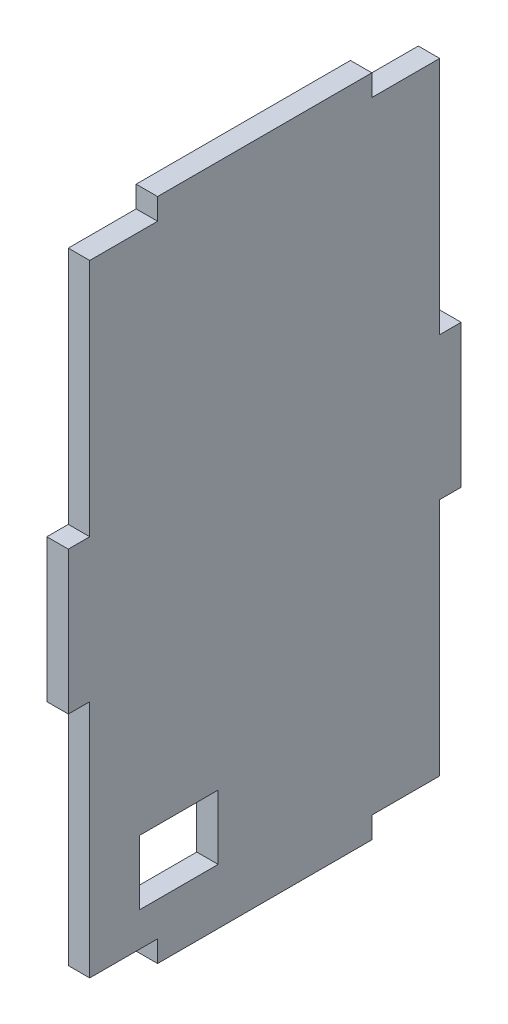
ISO-10303-21;
HEADER;
FILE_DESCRIPTION(('STEP AP214'),'2;1');
FILE_NAME('part.step','',(''),(''),'','','');
FILE_SCHEMA(('AUTOMOTIVE_DESIGN { 1 0 10303 214 1 1 1 1 }'));
ENDSEC;
DATA;
#1=APPLICATION_CONTEXT('core data for automotive mechanical design processes');
#2=APPLICATION_PROTOCOL_DEFINITION('international standard','automotive_design',2000,#1);
#3=PRODUCT_CONTEXT('',#1,'mechanical');
#4=PRODUCT('Part','Part','',(#3));
#5=PRODUCT_RELATED_PRODUCT_CATEGORY('part','',(#4));
#6=PRODUCT_DEFINITION_FORMATION('','',#4);
#7=PRODUCT_DEFINITION_CONTEXT('part definition',#1,'design');
#8=PRODUCT_DEFINITION('design','',#6,#7);
#9=PRODUCT_DEFINITION_SHAPE('','',#8);
#10=(LENGTH_UNIT() NAMED_UNIT(*) SI_UNIT(.MILLI.,.METRE.));
#11=(NAMED_UNIT(*) PLANE_ANGLE_UNIT() SI_UNIT($,.RADIAN.));
#12=(NAMED_UNIT(*) SI_UNIT($,.STERADIAN.) SOLID_ANGLE_UNIT());
#13=UNCERTAINTY_MEASURE_WITH_UNIT(LENGTH_MEASURE(1.E-05),#10,'distance_accuracy_value','');
#14=(GEOMETRIC_REPRESENTATION_CONTEXT(3) GLOBAL_UNCERTAINTY_ASSIGNED_CONTEXT((#13)) GLOBAL_UNIT_ASSIGNED_CONTEXT((#10,
#11,#12)) REPRESENTATION_CONTEXT('',''));
#15=CARTESIAN_POINT('',(0.,0.,0.));
#16=DIRECTION('',(0.,0.,1.));
#17=DIRECTION('',(1.,0.,0.));
#18=AXIS2_PLACEMENT_3D('',#15,#16,#17);
#19=CARTESIAN_POINT('',(3.,46.5,-27.5));
#20=DIRECTION('',(0.,0.,1.));
#21=DIRECTION('',(0.,-1.,0.));
#22=AXIS2_PLACEMENT_3D('',#19,#20,#21);
#23=PLANE('',#22);
#24=DIRECTION('',(0.,1.,0.));
#25=VECTOR('',#24,1.);
#26=CARTESIAN_POINT('',(3.,46.5,-27.5));
#27=LINE('',#26,#25);
#28=CARTESIAN_POINT('',(3.,-10.,-27.5));
#29=VERTEX_POINT('',#28);
#30=CARTESIAN_POINT('',(3.,10.,-27.5));
#31=VERTEX_POINT('',#30);
#32=EDGE_CURVE('E235',#29,#31,#27,.T.);
#33=ORIENTED_EDGE('',*,*,#32,.F.);
#34=DIRECTION('',(1.,0.,0.));
#35=VECTOR('',#34,1.);
#36=CARTESIAN_POINT('',(0.,-10.,-27.5));
#37=LINE('',#36,#35);
#38=CARTESIAN_POINT('',(0.,-10.,-27.5));
#39=VERTEX_POINT('',#38);
#40=EDGE_CURVE('E330',#39,#29,#37,.T.);
#41=ORIENTED_EDGE('',*,*,#40,.F.);
#42=DIRECTION('',(0.,1.,0.));
#43=VECTOR('',#42,1.);
#44=CARTESIAN_POINT('',(0.,46.5,-27.5));
#45=LINE('',#44,#43);
#46=CARTESIAN_POINT('',(0.,10.,-27.5));
#47=VERTEX_POINT('',#46);
#48=EDGE_CURVE('E225',#39,#47,#45,.T.);
#49=ORIENTED_EDGE('',*,*,#48,.T.);
#50=DIRECTION('',(1.,0.,0.));
#51=VECTOR('',#50,1.);
#52=CARTESIAN_POINT('',(0.,10.,-27.5));
#53=LINE('',#52,#51);
#54=EDGE_CURVE('E259',#47,#31,#53,.T.);
#55=ORIENTED_EDGE('',*,*,#54,.T.);
#56=EDGE_LOOP('',(#33,#41,#49,#55));
#57=FACE_BOUND('',#56,.T.);
#58=ADVANCED_FACE('F33',(#57),#23,.F.);
#59=CARTESIAN_POINT('',(3.,46.5,27.5));
#60=DIRECTION('',(0.,-1.,0.));
#61=DIRECTION('',(0.,0.,-1.));
#62=AXIS2_PLACEMENT_3D('',#59,#60,#61);
#63=PLANE('',#62);
#64=DIRECTION('',(0.,0.,1.));
#65=VECTOR('',#64,1.);
#66=CARTESIAN_POINT('',(3.,46.5,27.5));
#67=LINE('',#66,#65);
#68=CARTESIAN_POINT('',(3.,46.5,-15.));
#69=VERTEX_POINT('',#68);
#70=CARTESIAN_POINT('',(3.,46.5,15.));
#71=VERTEX_POINT('',#70);
#72=EDGE_CURVE('E215',#69,#71,#67,.T.);
#73=ORIENTED_EDGE('',*,*,#72,.F.);
#74=DIRECTION('',(1.,0.,0.));
#75=VECTOR('',#74,1.);
#76=CARTESIAN_POINT('',(0.,46.5,-15.));
#77=LINE('',#76,#75);
#78=CARTESIAN_POINT('',(0.,46.5,-15.));
#79=VERTEX_POINT('',#78);
#80=EDGE_CURVE('E199',#79,#69,#77,.T.);
#81=ORIENTED_EDGE('',*,*,#80,.F.);
#82=DIRECTION('',(0.,0.,1.));
#83=VECTOR('',#82,1.);
#84=CARTESIAN_POINT('',(0.,46.5,27.5));
#85=LINE('',#84,#83);
#86=CARTESIAN_POINT('',(0.,46.5,15.));
#87=VERTEX_POINT('',#86);
#88=EDGE_CURVE('E213',#79,#87,#85,.T.);
#89=ORIENTED_EDGE('',*,*,#88,.T.);
#90=DIRECTION('',(1.,0.,0.));
#91=VECTOR('',#90,1.);
#92=CARTESIAN_POINT('',(0.,46.5,15.));
#93=LINE('',#92,#91);
#94=EDGE_CURVE('E229',#87,#71,#93,.T.);
#95=ORIENTED_EDGE('',*,*,#94,.T.);
#96=EDGE_LOOP('',(#73,#81,#89,#95));
#97=FACE_BOUND('',#96,.T.);
#98=ADVANCED_FACE('F211',(#97),#63,.F.);
#99=CARTESIAN_POINT('',(3.,46.5,27.5));
#100=DIRECTION('',(0.,0.,-1.));
#101=DIRECTION('',(0.,1.,0.));
#102=AXIS2_PLACEMENT_3D('',#99,#100,#101);
#103=PLANE('',#102);
#104=DIRECTION('',(0.,-1.,0.));
#105=VECTOR('',#104,1.);
#106=CARTESIAN_POINT('',(0.,46.5,27.5));
#107=LINE('',#106,#105);
#108=CARTESIAN_POINT('',(0.,10.,27.5));
#109=VERTEX_POINT('',#108);
#110=CARTESIAN_POINT('',(0.,-10.,27.5));
#111=VERTEX_POINT('',#110);
#112=EDGE_CURVE('E224',#109,#111,#107,.T.);
#113=ORIENTED_EDGE('',*,*,#112,.T.);
#114=DIRECTION('',(1.,0.,0.));
#115=VECTOR('',#114,1.);
#116=CARTESIAN_POINT('',(0.,-10.,27.5));
#117=LINE('',#116,#115);
#118=CARTESIAN_POINT('',(3.,-10.,27.5));
#119=VERTEX_POINT('',#118);
#120=EDGE_CURVE('E277',#111,#119,#117,.T.);
#121=ORIENTED_EDGE('',*,*,#120,.T.);
#122=DIRECTION('',(0.,-1.,0.));
#123=VECTOR('',#122,1.);
#124=CARTESIAN_POINT('',(3.,46.5,27.5));
#125=LINE('',#124,#123);
#126=CARTESIAN_POINT('',(3.,10.,27.5));
#127=VERTEX_POINT('',#126);
#128=EDGE_CURVE('E41',#127,#119,#125,.T.);
#129=ORIENTED_EDGE('',*,*,#128,.F.);
#130=DIRECTION('',(1.,0.,0.));
#131=VECTOR('',#130,1.);
#132=CARTESIAN_POINT('',(0.,10.,27.5));
#133=LINE('',#132,#131);
#134=EDGE_CURVE('E238',#109,#127,#133,.T.);
#135=ORIENTED_EDGE('',*,*,#134,.F.);
#136=EDGE_LOOP('',(#113,#121,#129,#135));
#137=FACE_BOUND('',#136,.T.);
#138=ADVANCED_FACE('F438',(#137),#103,.F.);
#139=CARTESIAN_POINT('',(3.,-46.5,27.5));
#140=DIRECTION('',(0.,1.,0.));
#141=DIRECTION('',(0.,0.,1.));
#142=AXIS2_PLACEMENT_3D('',#139,#140,#141);
#143=PLANE('',#142);
#144=DIRECTION('',(0.,0.,-1.));
#145=VECTOR('',#144,1.);
#146=CARTESIAN_POINT('',(3.,-46.5,27.5));
#147=LINE('',#146,#145);
#148=CARTESIAN_POINT('',(3.,-46.5,15.));
#149=VERTEX_POINT('',#148);
#150=CARTESIAN_POINT('',(3.,-46.5,-15.));
#151=VERTEX_POINT('',#150);
#152=EDGE_CURVE('E11',#149,#151,#147,.T.);
#153=ORIENTED_EDGE('',*,*,#152,.F.);
#154=DIRECTION('',(1.,0.,0.));
#155=VECTOR('',#154,1.);
#156=CARTESIAN_POINT('',(0.,-46.5,15.));
#157=LINE('',#156,#155);
#158=CARTESIAN_POINT('',(0.,-46.5,15.));
#159=VERTEX_POINT('',#158);
#160=EDGE_CURVE('E268',#159,#149,#157,.T.);
#161=ORIENTED_EDGE('',*,*,#160,.F.);
#162=DIRECTION('',(0.,0.,-1.));
#163=VECTOR('',#162,1.);
#164=CARTESIAN_POINT('',(0.,-46.5,27.5));
#165=LINE('',#164,#163);
#166=CARTESIAN_POINT('',(0.,-46.5,-15.));
#167=VERTEX_POINT('',#166);
#168=EDGE_CURVE('E36',#159,#167,#165,.T.);
#169=ORIENTED_EDGE('',*,*,#168,.T.);
#170=DIRECTION('',(1.,0.,0.));
#171=VECTOR('',#170,1.);
#172=CARTESIAN_POINT('',(0.,-46.5,-15.));
#173=LINE('',#172,#171);
#174=EDGE_CURVE('E339',#167,#151,#173,.T.);
#175=ORIENTED_EDGE('',*,*,#174,.T.);
#176=EDGE_LOOP('',(#153,#161,#169,#175));
#177=FACE_BOUND('',#176,.T.);
#178=ADVANCED_FACE('F422',(#177),#143,.F.);
#179=CARTESIAN_POINT('',(3.,0.,0.));
#180=DIRECTION('',(1.,0.,0.));
#181=DIRECTION('',(0.,0.,-1.));
#182=AXIS2_PLACEMENT_3D('',#179,#180,#181);
#183=PLANE('',#182);
#184=DIRECTION('',(0.,0.,1.));
#185=VECTOR('',#184,1.);
#186=CARTESIAN_POINT('',(3.,-10.,27.5));
#187=LINE('',#186,#185);
#188=CARTESIAN_POINT('',(3.,-10.,24.5));
#189=VERTEX_POINT('',#188);
#190=EDGE_CURVE('E281',#189,#119,#187,.T.);
#191=ORIENTED_EDGE('',*,*,#190,.F.);
#192=DIRECTION('',(0.,1.,0.));
#193=VECTOR('',#192,1.);
#194=CARTESIAN_POINT('',(3.,-43.5,24.5));
#195=LINE('',#194,#193);
#196=CARTESIAN_POINT('',(3.,-43.5,24.5));
#197=VERTEX_POINT('',#196);
#198=EDGE_CURVE('E284',#197,#189,#195,.T.);
#199=ORIENTED_EDGE('',*,*,#198,.F.);
#200=DIRECTION('',(0.,0.,1.));
#201=VECTOR('',#200,1.);
#202=CARTESIAN_POINT('',(3.,-43.5,24.5));
#203=LINE('',#202,#201);
#204=CARTESIAN_POINT('',(3.,-43.5,15.));
#205=VERTEX_POINT('',#204);
#206=EDGE_CURVE('E287',#205,#197,#203,.T.);
#207=ORIENTED_EDGE('',*,*,#206,.F.);
#208=DIRECTION('',(0.,1.,0.));
#209=VECTOR('',#208,1.);
#210=CARTESIAN_POINT('',(3.,-46.5,15.));
#211=LINE('',#210,#209);
#212=EDGE_CURVE('E290',#149,#205,#211,.T.);
#213=ORIENTED_EDGE('',*,*,#212,.F.);
#214=ORIENTED_EDGE('',*,*,#152,.T.);
#215=DIRECTION('',(0.,-1.,0.));
#216=VECTOR('',#215,1.);
#217=CARTESIAN_POINT('',(3.,-46.5,-15.));
#218=LINE('',#217,#216);
#219=CARTESIAN_POINT('',(3.,-43.5,-15.));
#220=VERTEX_POINT('',#219);
#221=EDGE_CURVE('E343',#220,#151,#218,.T.);
#222=ORIENTED_EDGE('',*,*,#221,.F.);
#223=DIRECTION('',(0.,0.,1.));
#224=VECTOR('',#223,1.);
#225=CARTESIAN_POINT('',(3.,-43.5,-24.5));
#226=LINE('',#225,#224);
#227=CARTESIAN_POINT('',(3.,-43.5,-24.5));
#228=VERTEX_POINT('',#227);
#229=EDGE_CURVE('E346',#228,#220,#226,.T.);
#230=ORIENTED_EDGE('',*,*,#229,.F.);
#231=DIRECTION('',(0.,-1.,0.));
#232=VECTOR('',#231,1.);
#233=CARTESIAN_POINT('',(3.,-43.5,-24.5));
#234=LINE('',#233,#232);
#235=CARTESIAN_POINT('',(3.,-10.,-24.5));
#236=VERTEX_POINT('',#235);
#237=EDGE_CURVE('E349',#236,#228,#234,.T.);
#238=ORIENTED_EDGE('',*,*,#237,.F.);
#239=DIRECTION('',(0.,0.,1.));
#240=VECTOR('',#239,1.);
#241=CARTESIAN_POINT('',(3.,-10.,-27.5));
#242=LINE('',#241,#240);
#243=EDGE_CURVE('E280',#29,#236,#242,.T.);
#244=ORIENTED_EDGE('',*,*,#243,.F.);
#245=ORIENTED_EDGE('',*,*,#32,.T.);
#246=DIRECTION('',(0.,0.,-1.));
#247=VECTOR('',#246,1.);
#248=CARTESIAN_POINT('',(3.,10.,-27.5));
#249=LINE('',#248,#247);
#250=CARTESIAN_POINT('',(3.,10.,-24.5));
#251=VERTEX_POINT('',#250);
#252=EDGE_CURVE('E206',#251,#31,#249,.T.);
#253=ORIENTED_EDGE('',*,*,#252,.F.);
#254=DIRECTION('',(0.,-1.,0.));
#255=VECTOR('',#254,1.);
#256=CARTESIAN_POINT('',(3.,43.5,-24.5));
#257=LINE('',#256,#255);
#258=CARTESIAN_POINT('',(3.,43.5,-24.5));
#259=VERTEX_POINT('',#258);
#260=EDGE_CURVE('E372',#259,#251,#257,.T.);
#261=ORIENTED_EDGE('',*,*,#260,.F.);
#262=DIRECTION('',(0.,0.,-1.));
#263=VECTOR('',#262,1.);
#264=CARTESIAN_POINT('',(3.,43.5,-24.5));
#265=LINE('',#264,#263);
#266=CARTESIAN_POINT('',(3.,43.5,-15.));
#267=VERTEX_POINT('',#266);
#268=EDGE_CURVE('E375',#267,#259,#265,.T.);
#269=ORIENTED_EDGE('',*,*,#268,.F.);
#270=DIRECTION('',(0.,-1.,0.));
#271=VECTOR('',#270,1.);
#272=CARTESIAN_POINT('',(3.,46.5,-15.));
#273=LINE('',#272,#271);
#274=EDGE_CURVE('E342',#69,#267,#273,.T.);
#275=ORIENTED_EDGE('',*,*,#274,.F.);
#276=ORIENTED_EDGE('',*,*,#72,.T.);
#277=DIRECTION('',(0.,1.,0.));
#278=VECTOR('',#277,1.);
#279=CARTESIAN_POINT('',(3.,46.5,15.));
#280=LINE('',#279,#278);
#281=CARTESIAN_POINT('',(3.,43.5,15.));
#282=VERTEX_POINT('',#281);
#283=EDGE_CURVE('E247',#282,#71,#280,.T.);
#284=ORIENTED_EDGE('',*,*,#283,.F.);
#285=DIRECTION('',(0.,0.,-1.));
#286=VECTOR('',#285,1.);
#287=CARTESIAN_POINT('',(3.,43.5,24.5));
#288=LINE('',#287,#286);
#289=CARTESIAN_POINT('',(3.,43.5,24.5));
#290=VERTEX_POINT('',#289);
#291=EDGE_CURVE('E250',#290,#282,#288,.T.);
#292=ORIENTED_EDGE('',*,*,#291,.F.);
#293=DIRECTION('',(0.,1.,0.));
#294=VECTOR('',#293,1.);
#295=CARTESIAN_POINT('',(3.,43.5,24.5));
#296=LINE('',#295,#294);
#297=CARTESIAN_POINT('',(3.,10.,24.5));
#298=VERTEX_POINT('',#297);
#299=EDGE_CURVE('E253',#298,#290,#296,.T.);
#300=ORIENTED_EDGE('',*,*,#299,.F.);
#301=DIRECTION('',(0.,0.,-1.));
#302=VECTOR('',#301,1.);
#303=CARTESIAN_POINT('',(3.,10.,27.5));
#304=LINE('',#303,#302);
#305=EDGE_CURVE('E256',#127,#298,#304,.T.);
#306=ORIENTED_EDGE('',*,*,#305,.F.);
#307=ORIENTED_EDGE('',*,*,#128,.T.);
#308=EDGE_LOOP('',(#191,#199,#207,#213,#214,#222,#230,#238,#244,#245,#253,#261,#269,#275,#276,
#284,#292,#300,#306,#307));
#309=FACE_BOUND('',#308,.T.);
#310=DIRECTION('',(0.,1.,0.));
#311=VECTOR('',#310,1.);
#312=CARTESIAN_POINT('',(3.,-38.7190839201464,6.51515871286412));
#313=LINE('',#312,#311);
#314=CARTESIAN_POINT('',(3.,-38.7190839201464,6.51515871286412));
#315=VERTEX_POINT('',#314);
#316=CARTESIAN_POINT('',(3.,-29.7022633970635,6.51515871286412));
#317=VERTEX_POINT('',#316);
#318=EDGE_CURVE('E49',#315,#317,#313,.T.);
#319=ORIENTED_EDGE('',*,*,#318,.F.);
#320=DIRECTION('',(0.,0.,-1.));
#321=VECTOR('',#320,1.);
#322=CARTESIAN_POINT('',(3.,-38.7190839201464,6.51515871286412));
#323=LINE('',#322,#321);
#324=CARTESIAN_POINT('',(3.,-38.7190839201464,17.5129065776596));
#325=VERTEX_POINT('',#324);
#326=EDGE_CURVE('E309',#325,#315,#323,.T.);
#327=ORIENTED_EDGE('',*,*,#326,.F.);
#328=DIRECTION('',(0.,-1.,0.));
#329=VECTOR('',#328,1.);
#330=CARTESIAN_POINT('',(3.,-38.7190839201464,17.5129065776596));
#331=LINE('',#330,#329);
#332=CARTESIAN_POINT('',(3.,-29.7022633970635,17.5129065776596));
#333=VERTEX_POINT('',#332);
#334=EDGE_CURVE('E313',#333,#325,#331,.T.);
#335=ORIENTED_EDGE('',*,*,#334,.F.);
#336=DIRECTION('',(0.,0.,1.));
#337=VECTOR('',#336,1.);
#338=CARTESIAN_POINT('',(3.,-29.7022633970635,6.51515871286412));
#339=LINE('',#338,#337);
#340=EDGE_CURVE('E316',#317,#333,#339,.T.);
#341=ORIENTED_EDGE('',*,*,#340,.F.);
#342=EDGE_LOOP('',(#319,#327,#335,#341));
#343=FACE_BOUND('',#342,.T.);
#344=ADVANCED_FACE('F406',(#309,#343),#183,.T.);
#345=CARTESIAN_POINT('',(0.,0.,0.));
#346=DIRECTION('',(1.,0.,0.));
#347=DIRECTION('',(0.,0.,-1.));
#348=AXIS2_PLACEMENT_3D('',#345,#346,#347);
#349=PLANE('',#348);
#350=DIRECTION('',(0.,0.,-1.));
#351=VECTOR('',#350,1.);
#352=CARTESIAN_POINT('',(0.,-38.7190839201464,6.51515871286412));
#353=LINE('',#352,#351);
#354=CARTESIAN_POINT('',(0.,-38.7190839201464,17.5129065776596));
#355=VERTEX_POINT('',#354);
#356=CARTESIAN_POINT('',(0.,-38.7190839201464,6.51515871286412));
#357=VERTEX_POINT('',#356);
#358=EDGE_CURVE('E304',#355,#357,#353,.T.);
#359=ORIENTED_EDGE('',*,*,#358,.T.);
#360=DIRECTION('',(0.,1.,0.));
#361=VECTOR('',#360,1.);
#362=CARTESIAN_POINT('',(0.,-38.7190839201464,6.51515871286412));
#363=LINE('',#362,#361);
#364=CARTESIAN_POINT('',(0.,-29.7022633970635,6.51515871286412));
#365=VERTEX_POINT('',#364);
#366=EDGE_CURVE('E312',#357,#365,#363,.T.);
#367=ORIENTED_EDGE('',*,*,#366,.T.);
#368=DIRECTION('',(0.,0.,1.));
#369=VECTOR('',#368,1.);
#370=CARTESIAN_POINT('',(0.,-29.7022633970635,6.51515871286412));
#371=LINE('',#370,#369);
#372=CARTESIAN_POINT('',(0.,-29.7022633970635,17.5129065776596));
#373=VERTEX_POINT('',#372);
#374=EDGE_CURVE('E325',#365,#373,#371,.T.);
#375=ORIENTED_EDGE('',*,*,#374,.T.);
#376=DIRECTION('',(0.,-1.,0.));
#377=VECTOR('',#376,1.);
#378=CARTESIAN_POINT('',(0.,-38.7190839201464,17.5129065776596));
#379=LINE('',#378,#377);
#380=EDGE_CURVE('E322',#373,#355,#379,.T.);
#381=ORIENTED_EDGE('',*,*,#380,.T.);
#382=EDGE_LOOP('',(#359,#367,#375,#381));
#383=FACE_BOUND('',#382,.T.);
#384=DIRECTION('',(0.,1.,0.));
#385=VECTOR('',#384,1.);
#386=CARTESIAN_POINT('',(0.,-43.5,24.5));
#387=LINE('',#386,#385);
#388=CARTESIAN_POINT('',(0.,-43.5,24.5));
#389=VERTEX_POINT('',#388);
#390=CARTESIAN_POINT('',(0.,-10.,24.5));
#391=VERTEX_POINT('',#390);
#392=EDGE_CURVE('E296',#389,#391,#387,.T.);
#393=ORIENTED_EDGE('',*,*,#392,.T.);
#394=DIRECTION('',(0.,0.,1.));
#395=VECTOR('',#394,1.);
#396=CARTESIAN_POINT('',(0.,-10.,27.5));
#397=LINE('',#396,#395);
#398=EDGE_CURVE('E271',#391,#111,#397,.T.);
#399=ORIENTED_EDGE('',*,*,#398,.T.);
#400=ORIENTED_EDGE('',*,*,#112,.F.);
#401=DIRECTION('',(0.,0.,-1.));
#402=VECTOR('',#401,1.);
#403=CARTESIAN_POINT('',(0.,10.,27.5));
#404=LINE('',#403,#402);
#405=CARTESIAN_POINT('',(0.,10.,24.5));
#406=VERTEX_POINT('',#405);
#407=EDGE_CURVE('E249',#109,#406,#404,.T.);
#408=ORIENTED_EDGE('',*,*,#407,.T.);
#409=DIRECTION('',(0.,1.,0.));
#410=VECTOR('',#409,1.);
#411=CARTESIAN_POINT('',(0.,43.5,24.5));
#412=LINE('',#411,#410);
#413=CARTESIAN_POINT('',(0.,43.5,24.5));
#414=VERTEX_POINT('',#413);
#415=EDGE_CURVE('E263',#406,#414,#412,.T.);
#416=ORIENTED_EDGE('',*,*,#415,.T.);
#417=DIRECTION('',(0.,0.,-1.));
#418=VECTOR('',#417,1.);
#419=CARTESIAN_POINT('',(0.,43.5,24.5));
#420=LINE('',#419,#418);
#421=CARTESIAN_POINT('',(0.,43.5,15.));
#422=VERTEX_POINT('',#421);
#423=EDGE_CURVE('E261',#414,#422,#420,.T.);
#424=ORIENTED_EDGE('',*,*,#423,.T.);
#425=DIRECTION('',(0.,1.,0.));
#426=VECTOR('',#425,1.);
#427=CARTESIAN_POINT('',(0.,46.5,15.));
#428=LINE('',#427,#426);
#429=EDGE_CURVE('E223',#422,#87,#428,.T.);
#430=ORIENTED_EDGE('',*,*,#429,.T.);
#431=ORIENTED_EDGE('',*,*,#88,.F.);
#432=DIRECTION('',(0.,-1.,0.));
#433=VECTOR('',#432,1.);
#434=CARTESIAN_POINT('',(0.,46.5,-15.));
#435=LINE('',#434,#433);
#436=CARTESIAN_POINT('',(0.,43.5,-15.));
#437=VERTEX_POINT('',#436);
#438=EDGE_CURVE('E195',#79,#437,#435,.T.);
#439=ORIENTED_EDGE('',*,*,#438,.T.);
#440=DIRECTION('',(0.,0.,-1.));
#441=VECTOR('',#440,1.);
#442=CARTESIAN_POINT('',(0.,43.5,-24.5));
#443=LINE('',#442,#441);
#444=CARTESIAN_POINT('',(0.,43.5,-24.5));
#445=VERTEX_POINT('',#444);
#446=EDGE_CURVE('E205',#437,#445,#443,.T.);
#447=ORIENTED_EDGE('',*,*,#446,.T.);
#448=DIRECTION('',(0.,-1.,0.));
#449=VECTOR('',#448,1.);
#450=CARTESIAN_POINT('',(0.,43.5,-24.5));
#451=LINE('',#450,#449);
#452=CARTESIAN_POINT('',(0.,10.,-24.5));
#453=VERTEX_POINT('',#452);
#454=EDGE_CURVE('E381',#445,#453,#451,.T.);
#455=ORIENTED_EDGE('',*,*,#454,.T.);
#456=DIRECTION('',(0.,0.,-1.));
#457=VECTOR('',#456,1.);
#458=CARTESIAN_POINT('',(0.,10.,-27.5));
#459=LINE('',#458,#457);
#460=EDGE_CURVE('E216',#453,#47,#459,.T.);
#461=ORIENTED_EDGE('',*,*,#460,.T.);
#462=ORIENTED_EDGE('',*,*,#48,.F.);
#463=DIRECTION('',(0.,0.,1.));
#464=VECTOR('',#463,1.);
#465=CARTESIAN_POINT('',(0.,-10.,-27.5));
#466=LINE('',#465,#464);
#467=CARTESIAN_POINT('',(0.,-10.,-24.5));
#468=VERTEX_POINT('',#467);
#469=EDGE_CURVE('E345',#39,#468,#466,.T.);
#470=ORIENTED_EDGE('',*,*,#469,.T.);
#471=DIRECTION('',(0.,-1.,0.));
#472=VECTOR('',#471,1.);
#473=CARTESIAN_POINT('',(0.,-43.5,-24.5));
#474=LINE('',#473,#472);
#475=CARTESIAN_POINT('',(0.,-43.5,-24.5));
#476=VERTEX_POINT('',#475);
#477=EDGE_CURVE('E359',#468,#476,#474,.T.);
#478=ORIENTED_EDGE('',*,*,#477,.T.);
#479=DIRECTION('',(0.,0.,1.));
#480=VECTOR('',#479,1.);
#481=CARTESIAN_POINT('',(0.,-43.5,-24.5));
#482=LINE('',#481,#480);
#483=CARTESIAN_POINT('',(0.,-43.5,-15.));
#484=VERTEX_POINT('',#483);
#485=EDGE_CURVE('E356',#476,#484,#482,.T.);
#486=ORIENTED_EDGE('',*,*,#485,.T.);
#487=DIRECTION('',(0.,-1.,0.));
#488=VECTOR('',#487,1.);
#489=CARTESIAN_POINT('',(0.,-46.5,-15.));
#490=LINE('',#489,#488);
#491=EDGE_CURVE('E333',#484,#167,#490,.T.);
#492=ORIENTED_EDGE('',*,*,#491,.T.);
#493=ORIENTED_EDGE('',*,*,#168,.F.);
#494=DIRECTION('',(0.,1.,0.));
#495=VECTOR('',#494,1.);
#496=CARTESIAN_POINT('',(0.,-46.5,15.));
#497=LINE('',#496,#495);
#498=CARTESIAN_POINT('',(0.,-43.5,15.));
#499=VERTEX_POINT('',#498);
#500=EDGE_CURVE('E283',#159,#499,#497,.T.);
#501=ORIENTED_EDGE('',*,*,#500,.T.);
#502=DIRECTION('',(0.,0.,1.));
#503=VECTOR('',#502,1.);
#504=CARTESIAN_POINT('',(0.,-43.5,24.5));
#505=LINE('',#504,#503);
#506=EDGE_CURVE('E57',#499,#389,#505,.T.);
#507=ORIENTED_EDGE('',*,*,#506,.T.);
#508=EDGE_LOOP('',(#393,#399,#400,#408,#416,#424,#430,#431,#439,#447,#455,#461,#462,#470,#478,
#486,#492,#493,#501,#507));
#509=FACE_BOUND('',#508,.T.);
#510=ADVANCED_FACE('F220',(#383,#509),#349,.F.);
#511=CARTESIAN_POINT('',(0.,46.5,15.));
#512=DIRECTION('',(0.,0.,-1.));
#513=DIRECTION('',(0.,1.,0.));
#514=AXIS2_PLACEMENT_3D('',#511,#512,#513);
#515=PLANE('',#514);
#516=ORIENTED_EDGE('',*,*,#283,.T.);
#517=ORIENTED_EDGE('',*,*,#94,.F.);
#518=ORIENTED_EDGE('',*,*,#429,.F.);
#519=DIRECTION('',(1.,0.,0.));
#520=VECTOR('',#519,1.);
#521=CARTESIAN_POINT('',(0.,43.5,15.));
#522=LINE('',#521,#520);
#523=EDGE_CURVE('E244',#422,#282,#522,.T.);
#524=ORIENTED_EDGE('',*,*,#523,.T.);
#525=EDGE_LOOP('',(#516,#517,#518,#524));
#526=FACE_BOUND('',#525,.T.);
#527=ADVANCED_FACE('F453',(#526),#515,.F.);
#528=CARTESIAN_POINT('',(0.,43.5,24.5));
#529=DIRECTION('',(0.,-1.,0.));
#530=DIRECTION('',(0.,0.,-1.));
#531=AXIS2_PLACEMENT_3D('',#528,#529,#530);
#532=PLANE('',#531);
#533=ORIENTED_EDGE('',*,*,#291,.T.);
#534=ORIENTED_EDGE('',*,*,#523,.F.);
#535=ORIENTED_EDGE('',*,*,#423,.F.);
#536=DIRECTION('',(1.,0.,0.));
#537=VECTOR('',#536,1.);
#538=CARTESIAN_POINT('',(0.,43.5,24.5));
#539=LINE('',#538,#537);
#540=EDGE_CURVE('E242',#414,#290,#539,.T.);
#541=ORIENTED_EDGE('',*,*,#540,.T.);
#542=EDGE_LOOP('',(#533,#534,#535,#541));
#543=FACE_BOUND('',#542,.T.);
#544=ADVANCED_FACE('F450',(#543),#532,.F.);
#545=CARTESIAN_POINT('',(0.,43.5,24.5));
#546=DIRECTION('',(0.,0.,-1.));
#547=DIRECTION('',(0.,1.,0.));
#548=AXIS2_PLACEMENT_3D('',#545,#546,#547);
#549=PLANE('',#548);
#550=ORIENTED_EDGE('',*,*,#299,.T.);
#551=ORIENTED_EDGE('',*,*,#540,.F.);
#552=ORIENTED_EDGE('',*,*,#415,.F.);
#553=DIRECTION('',(1.,0.,0.));
#554=VECTOR('',#553,1.);
#555=CARTESIAN_POINT('',(0.,10.,24.5));
#556=LINE('',#555,#554);
#557=EDGE_CURVE('E240',#406,#298,#556,.T.);
#558=ORIENTED_EDGE('',*,*,#557,.T.);
#559=EDGE_LOOP('',(#550,#551,#552,#558));
#560=FACE_BOUND('',#559,.T.);
#561=ADVANCED_FACE('F448',(#560),#549,.F.);
#562=CARTESIAN_POINT('',(0.,10.,27.5));
#563=DIRECTION('',(0.,-1.,0.));
#564=DIRECTION('',(0.,0.,-1.));
#565=AXIS2_PLACEMENT_3D('',#562,#563,#564);
#566=PLANE('',#565);
#567=ORIENTED_EDGE('',*,*,#305,.T.);
#568=ORIENTED_EDGE('',*,*,#557,.F.);
#569=ORIENTED_EDGE('',*,*,#407,.F.);
#570=ORIENTED_EDGE('',*,*,#134,.T.);
#571=EDGE_LOOP('',(#567,#568,#569,#570));
#572=FACE_BOUND('',#571,.T.);
#573=ADVANCED_FACE('F445',(#572),#566,.F.);
#574=CARTESIAN_POINT('',(0.,10.,-27.5));
#575=DIRECTION('',(0.,-1.,0.));
#576=DIRECTION('',(0.,0.,-1.));
#577=AXIS2_PLACEMENT_3D('',#574,#575,#576);
#578=PLANE('',#577);
#579=ORIENTED_EDGE('',*,*,#252,.T.);
#580=ORIENTED_EDGE('',*,*,#54,.F.);
#581=ORIENTED_EDGE('',*,*,#460,.F.);
#582=DIRECTION('',(1.,0.,0.));
#583=VECTOR('',#582,1.);
#584=CARTESIAN_POINT('',(0.,10.,-24.5));
#585=LINE('',#584,#583);
#586=EDGE_CURVE('E367',#453,#251,#585,.T.);
#587=ORIENTED_EDGE('',*,*,#586,.T.);
#588=EDGE_LOOP('',(#579,#580,#581,#587));
#589=FACE_BOUND('',#588,.T.);
#590=ADVANCED_FACE('F394',(#589),#578,.F.);
#591=CARTESIAN_POINT('',(0.,43.5,-24.5));
#592=DIRECTION('',(0.,0.,1.));
#593=DIRECTION('',(0.,-1.,0.));
#594=AXIS2_PLACEMENT_3D('',#591,#592,#593);
#595=PLANE('',#594);
#596=ORIENTED_EDGE('',*,*,#260,.T.);
#597=ORIENTED_EDGE('',*,*,#586,.F.);
#598=ORIENTED_EDGE('',*,*,#454,.F.);
#599=DIRECTION('',(1.,0.,0.));
#600=VECTOR('',#599,1.);
#601=CARTESIAN_POINT('',(0.,43.5,-24.5));
#602=LINE('',#601,#600);
#603=EDGE_CURVE('E365',#445,#259,#602,.T.);
#604=ORIENTED_EDGE('',*,*,#603,.T.);
#605=EDGE_LOOP('',(#596,#597,#598,#604));
#606=FACE_BOUND('',#605,.T.);
#607=ADVANCED_FACE('F390',(#606),#595,.F.);
#608=CARTESIAN_POINT('',(0.,43.5,-24.5));
#609=DIRECTION('',(0.,-1.,0.));
#610=DIRECTION('',(0.,0.,-1.));
#611=AXIS2_PLACEMENT_3D('',#608,#609,#610);
#612=PLANE('',#611);
#613=ORIENTED_EDGE('',*,*,#268,.T.);
#614=ORIENTED_EDGE('',*,*,#603,.F.);
#615=ORIENTED_EDGE('',*,*,#446,.F.);
#616=DIRECTION('',(1.,0.,0.));
#617=VECTOR('',#616,1.);
#618=CARTESIAN_POINT('',(0.,43.5,-15.));
#619=LINE('',#618,#617);
#620=EDGE_CURVE('E201',#437,#267,#619,.T.);
#621=ORIENTED_EDGE('',*,*,#620,.T.);
#622=EDGE_LOOP('',(#613,#614,#615,#621));
#623=FACE_BOUND('',#622,.T.);
#624=ADVANCED_FACE('F386',(#623),#612,.F.);
#625=CARTESIAN_POINT('',(0.,46.5,-15.));
#626=DIRECTION('',(0.,0.,1.));
#627=DIRECTION('',(0.,-1.,0.));
#628=AXIS2_PLACEMENT_3D('',#625,#626,#627);
#629=PLANE('',#628);
#630=ORIENTED_EDGE('',*,*,#274,.T.);
#631=ORIENTED_EDGE('',*,*,#620,.F.);
#632=ORIENTED_EDGE('',*,*,#438,.F.);
#633=ORIENTED_EDGE('',*,*,#80,.T.);
#634=EDGE_LOOP('',(#630,#631,#632,#633));
#635=FACE_BOUND('',#634,.T.);
#636=ADVANCED_FACE('F198',(#635),#629,.F.);
#637=CARTESIAN_POINT('',(0.,-46.5,-15.));
#638=DIRECTION('',(0.,0.,1.));
#639=DIRECTION('',(0.,-1.,0.));
#640=AXIS2_PLACEMENT_3D('',#637,#638,#639);
#641=PLANE('',#640);
#642=ORIENTED_EDGE('',*,*,#221,.T.);
#643=ORIENTED_EDGE('',*,*,#174,.F.);
#644=ORIENTED_EDGE('',*,*,#491,.F.);
#645=DIRECTION('',(1.,0.,0.));
#646=VECTOR('',#645,1.);
#647=CARTESIAN_POINT('',(0.,-43.5,-15.));
#648=LINE('',#647,#646);
#649=EDGE_CURVE('E337',#484,#220,#648,.T.);
#650=ORIENTED_EDGE('',*,*,#649,.T.);
#651=EDGE_LOOP('',(#642,#643,#644,#650));
#652=FACE_BOUND('',#651,.T.);
#653=ADVANCED_FACE('F419',(#652),#641,.F.);
#654=CARTESIAN_POINT('',(0.,-43.5,-24.5));
#655=DIRECTION('',(0.,1.,0.));
#656=DIRECTION('',(0.,0.,1.));
#657=AXIS2_PLACEMENT_3D('',#654,#655,#656);
#658=PLANE('',#657);
#659=ORIENTED_EDGE('',*,*,#229,.T.);
#660=ORIENTED_EDGE('',*,*,#649,.F.);
#661=ORIENTED_EDGE('',*,*,#485,.F.);
#662=DIRECTION('',(1.,0.,0.));
#663=VECTOR('',#662,1.);
#664=CARTESIAN_POINT('',(0.,-43.5,-24.5));
#665=LINE('',#664,#663);
#666=EDGE_CURVE('E335',#476,#228,#665,.T.);
#667=ORIENTED_EDGE('',*,*,#666,.T.);
#668=EDGE_LOOP('',(#659,#660,#661,#667));
#669=FACE_BOUND('',#668,.T.);
#670=ADVANCED_FACE('F417',(#669),#658,.F.);
#671=CARTESIAN_POINT('',(0.,-43.5,-24.5));
#672=DIRECTION('',(0.,0.,1.));
#673=DIRECTION('',(0.,-1.,0.));
#674=AXIS2_PLACEMENT_3D('',#671,#672,#673);
#675=PLANE('',#674);
#676=ORIENTED_EDGE('',*,*,#237,.T.);
#677=ORIENTED_EDGE('',*,*,#666,.F.);
#678=ORIENTED_EDGE('',*,*,#477,.F.);
#679=DIRECTION('',(1.,0.,0.));
#680=VECTOR('',#679,1.);
#681=CARTESIAN_POINT('',(0.,-10.,-24.5));
#682=LINE('',#681,#680);
#683=EDGE_CURVE('E332',#468,#236,#682,.T.);
#684=ORIENTED_EDGE('',*,*,#683,.T.);
#685=EDGE_LOOP('',(#676,#677,#678,#684));
#686=FACE_BOUND('',#685,.T.);
#687=ADVANCED_FACE('F411',(#686),#675,.F.);
#688=CARTESIAN_POINT('',(0.,-10.,-27.5));
#689=DIRECTION('',(0.,1.,0.));
#690=DIRECTION('',(0.,0.,1.));
#691=AXIS2_PLACEMENT_3D('',#688,#689,#690);
#692=PLANE('',#691);
#693=ORIENTED_EDGE('',*,*,#243,.T.);
#694=ORIENTED_EDGE('',*,*,#683,.F.);
#695=ORIENTED_EDGE('',*,*,#469,.F.);
#696=ORIENTED_EDGE('',*,*,#40,.T.);
#697=EDGE_LOOP('',(#693,#694,#695,#696));
#698=FACE_BOUND('',#697,.T.);
#699=ADVANCED_FACE('F401',(#698),#692,.F.);
#700=CARTESIAN_POINT('',(0.,-38.7190839201464,6.51515871286412));
#701=DIRECTION('',(0.,0.,-1.));
#702=DIRECTION('',(-1.,0.,0.));
#703=AXIS2_PLACEMENT_3D('',#700,#701,#702);
#704=PLANE('',#703);
#705=ORIENTED_EDGE('',*,*,#318,.T.);
#706=DIRECTION('',(1.,0.,0.));
#707=VECTOR('',#706,1.);
#708=CARTESIAN_POINT('',(0.,-29.7022633970635,6.51515871286412));
#709=LINE('',#708,#707);
#710=EDGE_CURVE('E301',#365,#317,#709,.T.);
#711=ORIENTED_EDGE('',*,*,#710,.F.);
#712=ORIENTED_EDGE('',*,*,#366,.F.);
#713=DIRECTION('',(1.,0.,0.));
#714=VECTOR('',#713,1.);
#715=CARTESIAN_POINT('',(0.,-38.7190839201464,6.51515871286412));
#716=LINE('',#715,#714);
#717=EDGE_CURVE('E293',#357,#315,#716,.T.);
#718=ORIENTED_EDGE('',*,*,#717,.T.);
#719=EDGE_LOOP('',(#705,#711,#712,#718));
#720=FACE_BOUND('',#719,.T.);
#721=ADVANCED_FACE('F536',(#720),#704,.F.);
#722=CARTESIAN_POINT('',(0.,-38.7190839201464,6.51515871286412));
#723=DIRECTION('',(0.,-1.,0.));
#724=DIRECTION('',(0.,0.,-1.));
#725=AXIS2_PLACEMENT_3D('',#722,#723,#724);
#726=PLANE('',#725);
#727=ORIENTED_EDGE('',*,*,#326,.T.);
#728=ORIENTED_EDGE('',*,*,#717,.F.);
#729=ORIENTED_EDGE('',*,*,#358,.F.);
#730=DIRECTION('',(1.,0.,0.));
#731=VECTOR('',#730,1.);
#732=CARTESIAN_POINT('',(0.,-38.7190839201464,17.5129065776596));
#733=LINE('',#732,#731);
#734=EDGE_CURVE('E306',#355,#325,#733,.T.);
#735=ORIENTED_EDGE('',*,*,#734,.T.);
#736=EDGE_LOOP('',(#727,#728,#729,#735));
#737=FACE_BOUND('',#736,.T.);
#738=ADVANCED_FACE('F543',(#737),#726,.F.);
#739=CARTESIAN_POINT('',(0.,-38.7190839201464,17.5129065776596));
#740=DIRECTION('',(0.,0.,1.));
#741=DIRECTION('',(1.,0.,0.));
#742=AXIS2_PLACEMENT_3D('',#739,#740,#741);
#743=PLANE('',#742);
#744=ORIENTED_EDGE('',*,*,#334,.T.);
#745=ORIENTED_EDGE('',*,*,#734,.F.);
#746=ORIENTED_EDGE('',*,*,#380,.F.);
#747=DIRECTION('',(1.,0.,0.));
#748=VECTOR('',#747,1.);
#749=CARTESIAN_POINT('',(0.,-29.7022633970635,17.5129065776596));
#750=LINE('',#749,#748);
#751=EDGE_CURVE('E303',#373,#333,#750,.T.);
#752=ORIENTED_EDGE('',*,*,#751,.T.);
#753=EDGE_LOOP('',(#744,#745,#746,#752));
#754=FACE_BOUND('',#753,.T.);
#755=ADVANCED_FACE('F550',(#754),#743,.F.);
#756=CARTESIAN_POINT('',(0.,-29.7022633970635,6.51515871286412));
#757=DIRECTION('',(0.,1.,0.));
#758=DIRECTION('',(0.,0.,1.));
#759=AXIS2_PLACEMENT_3D('',#756,#757,#758);
#760=PLANE('',#759);
#761=ORIENTED_EDGE('',*,*,#340,.T.);
#762=ORIENTED_EDGE('',*,*,#751,.F.);
#763=ORIENTED_EDGE('',*,*,#374,.F.);
#764=ORIENTED_EDGE('',*,*,#710,.T.);
#765=EDGE_LOOP('',(#761,#762,#763,#764));
#766=FACE_BOUND('',#765,.T.);
#767=ADVANCED_FACE('F558',(#766),#760,.F.);
#768=CARTESIAN_POINT('',(0.,-10.,27.5));
#769=DIRECTION('',(0.,1.,0.));
#770=DIRECTION('',(0.,0.,1.));
#771=AXIS2_PLACEMENT_3D('',#768,#769,#770);
#772=PLANE('',#771);
#773=ORIENTED_EDGE('',*,*,#190,.T.);
#774=ORIENTED_EDGE('',*,*,#120,.F.);
#775=ORIENTED_EDGE('',*,*,#398,.F.);
#776=DIRECTION('',(1.,0.,0.));
#777=VECTOR('',#776,1.);
#778=CARTESIAN_POINT('',(0.,-10.,24.5));
#779=LINE('',#778,#777);
#780=EDGE_CURVE('E275',#391,#189,#779,.T.);
#781=ORIENTED_EDGE('',*,*,#780,.T.);
#782=EDGE_LOOP('',(#773,#774,#775,#781));
#783=FACE_BOUND('',#782,.T.);
#784=ADVANCED_FACE('F435',(#783),#772,.F.);
#785=CARTESIAN_POINT('',(0.,-43.5,24.5));
#786=DIRECTION('',(0.,0.,-1.));
#787=DIRECTION('',(0.,1.,0.));
#788=AXIS2_PLACEMENT_3D('',#785,#786,#787);
#789=PLANE('',#788);
#790=ORIENTED_EDGE('',*,*,#198,.T.);
#791=ORIENTED_EDGE('',*,*,#780,.F.);
#792=ORIENTED_EDGE('',*,*,#392,.F.);
#793=DIRECTION('',(1.,0.,0.));
#794=VECTOR('',#793,1.);
#795=CARTESIAN_POINT('',(0.,-43.5,24.5));
#796=LINE('',#795,#794);
#797=EDGE_CURVE('E273',#389,#197,#796,.T.);
#798=ORIENTED_EDGE('',*,*,#797,.T.);
#799=EDGE_LOOP('',(#790,#791,#792,#798));
#800=FACE_BOUND('',#799,.T.);
#801=ADVANCED_FACE('F433',(#800),#789,.F.);
#802=CARTESIAN_POINT('',(0.,-43.5,24.5));
#803=DIRECTION('',(0.,1.,0.));
#804=DIRECTION('',(0.,0.,1.));
#805=AXIS2_PLACEMENT_3D('',#802,#803,#804);
#806=PLANE('',#805);
#807=ORIENTED_EDGE('',*,*,#206,.T.);
#808=ORIENTED_EDGE('',*,*,#797,.F.);
#809=ORIENTED_EDGE('',*,*,#506,.F.);
#810=DIRECTION('',(1.,0.,0.));
#811=VECTOR('',#810,1.);
#812=CARTESIAN_POINT('',(0.,-43.5,15.));
#813=LINE('',#812,#811);
#814=EDGE_CURVE('E270',#499,#205,#813,.T.);
#815=ORIENTED_EDGE('',*,*,#814,.T.);
#816=EDGE_LOOP('',(#807,#808,#809,#815));
#817=FACE_BOUND('',#816,.T.);
#818=ADVANCED_FACE('F579',(#817),#806,.F.);
#819=CARTESIAN_POINT('',(0.,-46.5,15.));
#820=DIRECTION('',(0.,0.,-1.));
#821=DIRECTION('',(0.,1.,0.));
#822=AXIS2_PLACEMENT_3D('',#819,#820,#821);
#823=PLANE('',#822);
#824=ORIENTED_EDGE('',*,*,#212,.T.);
#825=ORIENTED_EDGE('',*,*,#814,.F.);
#826=ORIENTED_EDGE('',*,*,#500,.F.);
#827=ORIENTED_EDGE('',*,*,#160,.T.);
#828=EDGE_LOOP('',(#824,#825,#826,#827));
#829=FACE_BOUND('',#828,.T.);
#830=ADVANCED_FACE('F428',(#829),#823,.F.);
#831=CLOSED_SHELL('',(#58,#98,#138,#178,#344,#510,#527,#544,#561,#573,#590,#607,#624,#636,#653,
#670,#687,#699,#721,#738,#755,#767,#784,#801,#818,#830));
#832=MANIFOLD_SOLID_BREP('B2',#831);
#833=ADVANCED_BREP_SHAPE_REPRESENTATION('',(#18,#832),#14);
#834=SHAPE_DEFINITION_REPRESENTATION(#9,#833);
ENDSEC;
END-ISO-10303-21;
